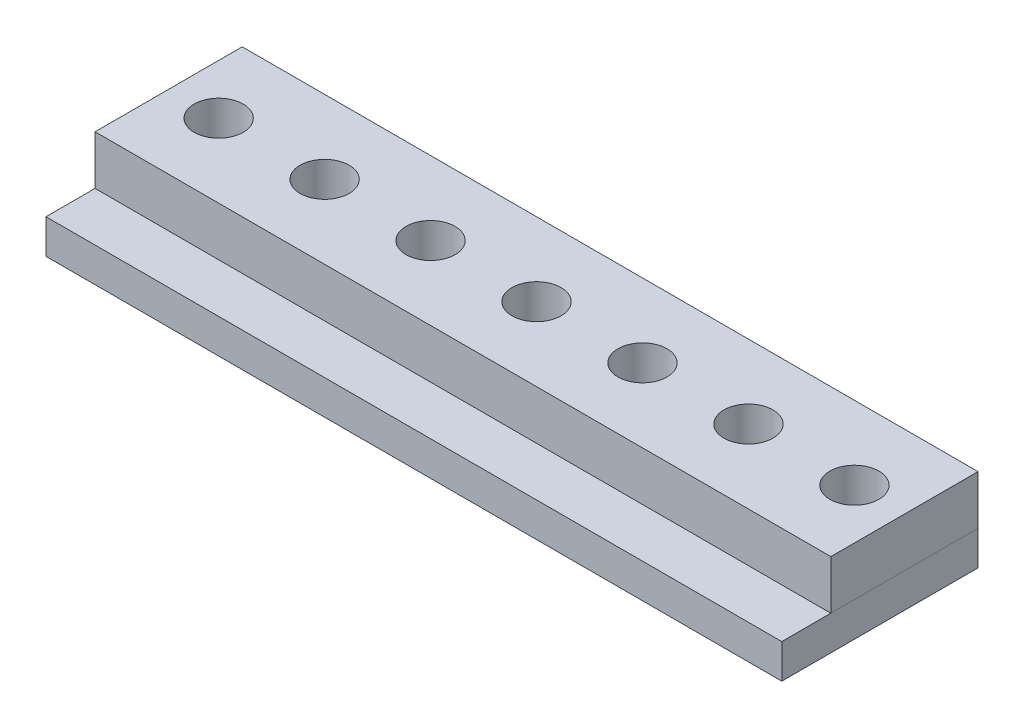
ISO-10303-21;
HEADER;
FILE_DESCRIPTION(('STEP AP214'),'2;1');
FILE_NAME('part.step','',(''),(''),'','','');
FILE_SCHEMA(('AUTOMOTIVE_DESIGN { 1 0 10303 214 1 1 1 1 }'));
ENDSEC;
DATA;
#1=APPLICATION_CONTEXT('core data for automotive mechanical design processes');
#2=APPLICATION_PROTOCOL_DEFINITION('international standard','automotive_design',2000,#1);
#3=PRODUCT_CONTEXT('',#1,'mechanical');
#4=PRODUCT('Part','Part','',(#3));
#5=PRODUCT_RELATED_PRODUCT_CATEGORY('part','',(#4));
#6=PRODUCT_DEFINITION_FORMATION('','',#4);
#7=PRODUCT_DEFINITION_CONTEXT('part definition',#1,'design');
#8=PRODUCT_DEFINITION('design','',#6,#7);
#9=PRODUCT_DEFINITION_SHAPE('','',#8);
#10=(LENGTH_UNIT() NAMED_UNIT(*) SI_UNIT(.MILLI.,.METRE.));
#11=(NAMED_UNIT(*) PLANE_ANGLE_UNIT() SI_UNIT($,.RADIAN.));
#12=(NAMED_UNIT(*) SI_UNIT($,.STERADIAN.) SOLID_ANGLE_UNIT());
#13=UNCERTAINTY_MEASURE_WITH_UNIT(LENGTH_MEASURE(1.E-05),#10,'distance_accuracy_value','');
#14=(GEOMETRIC_REPRESENTATION_CONTEXT(3) GLOBAL_UNCERTAINTY_ASSIGNED_CONTEXT((#13)) GLOBAL_UNIT_ASSIGNED_CONTEXT((#10,
#11,#12)) REPRESENTATION_CONTEXT('',''));
#15=CARTESIAN_POINT('',(0.,0.,0.));
#16=DIRECTION('',(0.,0.,1.));
#17=DIRECTION('',(1.,0.,0.));
#18=AXIS2_PLACEMENT_3D('',#15,#16,#17);
#19=CARTESIAN_POINT('',(-750.,-70.,-150.));
#20=DIRECTION('',(1.,0.,0.));
#21=DIRECTION('',(0.,0.,-1.));
#22=AXIS2_PLACEMENT_3D('',#19,#20,#21);
#23=PLANE('',#22);
#24=DIRECTION('',(0.,0.,-1.));
#25=VECTOR('',#24,1.);
#26=CARTESIAN_POINT('',(-750.,0.,-150.));
#27=LINE('',#26,#25);
#28=CARTESIAN_POINT('',(-750.,0.,250.));
#29=VERTEX_POINT('',#28);
#30=CARTESIAN_POINT('',(-750.,0.,-150.));
#31=VERTEX_POINT('',#30);
#32=EDGE_CURVE('E117',#29,#31,#27,.T.);
#33=ORIENTED_EDGE('',*,*,#32,.T.);
#34=DIRECTION('',(0.,1.,0.));
#35=VECTOR('',#34,1.);
#36=CARTESIAN_POINT('',(-750.,-70.,-150.));
#37=LINE('',#36,#35);
#38=CARTESIAN_POINT('',(-750.,-70.,-150.));
#39=VERTEX_POINT('',#38);
#40=EDGE_CURVE('E12',#39,#31,#37,.T.);
#41=ORIENTED_EDGE('',*,*,#40,.F.);
#42=DIRECTION('',(0.,0.,-1.));
#43=VECTOR('',#42,1.);
#44=CARTESIAN_POINT('',(-750.,-70.,-150.));
#45=LINE('',#44,#43);
#46=CARTESIAN_POINT('',(-750.,-70.,250.));
#47=VERTEX_POINT('',#46);
#48=EDGE_CURVE('E101',#47,#39,#45,.T.);
#49=ORIENTED_EDGE('',*,*,#48,.F.);
#50=DIRECTION('',(0.,1.,0.));
#51=VECTOR('',#50,1.);
#52=CARTESIAN_POINT('',(-750.,-70.,250.));
#53=LINE('',#52,#51);
#54=EDGE_CURVE('E113',#47,#29,#53,.T.);
#55=ORIENTED_EDGE('',*,*,#54,.T.);
#56=EDGE_LOOP('',(#33,#41,#49,#55));
#57=FACE_BOUND('',#56,.T.);
#58=ADVANCED_FACE('F49',(#57),#23,.F.);
#59=CARTESIAN_POINT('',(-750.,-70.,-150.));
#60=DIRECTION('',(0.,0.,1.));
#61=DIRECTION('',(1.,0.,0.));
#62=AXIS2_PLACEMENT_3D('',#59,#60,#61);
#63=PLANE('',#62);
#64=DIRECTION('',(1.,0.,0.));
#65=VECTOR('',#64,1.);
#66=CARTESIAN_POINT('',(-750.,0.,-150.));
#67=LINE('',#66,#65);
#68=CARTESIAN_POINT('',(750.,0.,-150.));
#69=VERTEX_POINT('',#68);
#70=EDGE_CURVE('E106',#31,#69,#67,.T.);
#71=ORIENTED_EDGE('',*,*,#70,.T.);
#72=DIRECTION('',(0.,1.,0.));
#73=VECTOR('',#72,1.);
#74=CARTESIAN_POINT('',(750.,-70.,-150.));
#75=LINE('',#74,#73);
#76=CARTESIAN_POINT('',(750.,-70.,-150.));
#77=VERTEX_POINT('',#76);
#78=EDGE_CURVE('E58',#77,#69,#75,.T.);
#79=ORIENTED_EDGE('',*,*,#78,.F.);
#80=DIRECTION('',(1.,0.,0.));
#81=VECTOR('',#80,1.);
#82=CARTESIAN_POINT('',(-750.,-70.,-150.));
#83=LINE('',#82,#81);
#84=EDGE_CURVE('E96',#39,#77,#83,.T.);
#85=ORIENTED_EDGE('',*,*,#84,.F.);
#86=ORIENTED_EDGE('',*,*,#40,.T.);
#87=EDGE_LOOP('',(#71,#79,#85,#86));
#88=FACE_BOUND('',#87,.T.);
#89=ADVANCED_FACE('F105',(#88),#63,.F.);
#90=CARTESIAN_POINT('',(750.,-70.,-150.));
#91=DIRECTION('',(-1.,0.,0.));
#92=DIRECTION('',(0.,0.,1.));
#93=AXIS2_PLACEMENT_3D('',#90,#91,#92);
#94=PLANE('',#93);
#95=DIRECTION('',(0.,0.,1.));
#96=VECTOR('',#95,1.);
#97=CARTESIAN_POINT('',(750.,0.,-150.));
#98=LINE('',#97,#96);
#99=CARTESIAN_POINT('',(750.,0.,250.));
#100=VERTEX_POINT('',#99);
#101=EDGE_CURVE('E83',#69,#100,#98,.T.);
#102=ORIENTED_EDGE('',*,*,#101,.T.);
#103=DIRECTION('',(0.,1.,0.));
#104=VECTOR('',#103,1.);
#105=CARTESIAN_POINT('',(750.,-70.,250.));
#106=LINE('',#105,#104);
#107=CARTESIAN_POINT('',(750.,-70.,250.));
#108=VERTEX_POINT('',#107);
#109=EDGE_CURVE('E108',#108,#100,#106,.T.);
#110=ORIENTED_EDGE('',*,*,#109,.F.);
#111=DIRECTION('',(0.,0.,1.));
#112=VECTOR('',#111,1.);
#113=CARTESIAN_POINT('',(750.,-70.,-150.));
#114=LINE('',#113,#112);
#115=EDGE_CURVE('E99',#77,#108,#114,.T.);
#116=ORIENTED_EDGE('',*,*,#115,.F.);
#117=ORIENTED_EDGE('',*,*,#78,.T.);
#118=EDGE_LOOP('',(#102,#110,#116,#117));
#119=FACE_BOUND('',#118,.T.);
#120=ADVANCED_FACE('F109',(#119),#94,.F.);
#121=CARTESIAN_POINT('',(-750.,-70.,250.));
#122=DIRECTION('',(0.,0.,-1.));
#123=DIRECTION('',(-1.,0.,0.));
#124=AXIS2_PLACEMENT_3D('',#121,#122,#123);
#125=PLANE('',#124);
#126=DIRECTION('',(-1.,0.,0.));
#127=VECTOR('',#126,1.);
#128=CARTESIAN_POINT('',(-750.,0.,250.));
#129=LINE('',#128,#127);
#130=EDGE_CURVE('E89',#100,#29,#129,.T.);
#131=ORIENTED_EDGE('',*,*,#130,.T.);
#132=ORIENTED_EDGE('',*,*,#54,.F.);
#133=DIRECTION('',(-1.,0.,0.));
#134=VECTOR('',#133,1.);
#135=CARTESIAN_POINT('',(-750.,-70.,250.));
#136=LINE('',#135,#134);
#137=EDGE_CURVE('E66',#108,#47,#136,.T.);
#138=ORIENTED_EDGE('',*,*,#137,.F.);
#139=ORIENTED_EDGE('',*,*,#109,.T.);
#140=EDGE_LOOP('',(#131,#132,#138,#139));
#141=FACE_BOUND('',#140,.T.);
#142=ADVANCED_FACE('F130',(#141),#125,.F.);
#143=CARTESIAN_POINT('',(0.,-70.,0.));
#144=DIRECTION('',(0.,1.,0.));
#145=DIRECTION('',(0.,0.,1.));
#146=AXIS2_PLACEMENT_3D('',#143,#144,#145);
#147=PLANE('',#146);
#148=ORIENTED_EDGE('',*,*,#48,.T.);
#149=ORIENTED_EDGE('',*,*,#84,.T.);
#150=ORIENTED_EDGE('',*,*,#115,.T.);
#151=ORIENTED_EDGE('',*,*,#137,.T.);
#152=EDGE_LOOP('',(#148,#149,#150,#151));
#153=FACE_BOUND('',#152,.T.);
#154=ADVANCED_FACE('F97',(#153),#147,.F.);
#155=CARTESIAN_POINT('',(0.,0.,0.));
#156=DIRECTION('',(0.,1.,0.));
#157=DIRECTION('',(0.,0.,1.));
#158=AXIS2_PLACEMENT_3D('',#155,#156,#157);
#159=PLANE('',#158);
#160=ORIENTED_EDGE('',*,*,#32,.F.);
#161=ORIENTED_EDGE('',*,*,#130,.F.);
#162=ORIENTED_EDGE('',*,*,#101,.F.);
#163=ORIENTED_EDGE('',*,*,#70,.F.);
#164=EDGE_LOOP('',(#160,#161,#162,#163));
#165=FACE_BOUND('',#164,.T.);
#166=ADVANCED_FACE('F133',(#165),#159,.T.);
#167=CLOSED_SHELL('',(#58,#89,#120,#142,#154,#166));
#168=MANIFOLD_SOLID_BREP('B2',#167);
#169=CARTESIAN_POINT('',(0.,100.,0.));
#170=DIRECTION('',(0.,-1.,0.));
#171=DIRECTION('',(0.,0.,-1.));
#172=AXIS2_PLACEMENT_3D('',#169,#170,#171);
#173=PLANE('',#172);
#174=DIRECTION('',(0.,0.,-1.));
#175=VECTOR('',#174,1.);
#176=CARTESIAN_POINT('',(750.,100.,150.));
#177=LINE('',#176,#175);
#178=CARTESIAN_POINT('',(750.,100.,150.));
#179=VERTEX_POINT('',#178);
#180=CARTESIAN_POINT('',(750.,100.,-150.));
#181=VERTEX_POINT('',#180);
#182=EDGE_CURVE('E237',#179,#181,#177,.T.);
#183=ORIENTED_EDGE('',*,*,#182,.T.);
#184=DIRECTION('',(-1.,0.,0.));
#185=VECTOR('',#184,1.);
#186=CARTESIAN_POINT('',(-750.,100.,-150.));
#187=LINE('',#186,#185);
#188=CARTESIAN_POINT('',(-750.,100.,-150.));
#189=VERTEX_POINT('',#188);
#190=EDGE_CURVE('E232',#181,#189,#187,.T.);
#191=ORIENTED_EDGE('',*,*,#190,.T.);
#192=DIRECTION('',(0.,0.,1.));
#193=VECTOR('',#192,1.);
#194=CARTESIAN_POINT('',(-750.,100.,150.));
#195=LINE('',#194,#193);
#196=CARTESIAN_POINT('',(-750.,100.,150.));
#197=VERTEX_POINT('',#196);
#198=EDGE_CURVE('E235',#189,#197,#195,.T.);
#199=ORIENTED_EDGE('',*,*,#198,.T.);
#200=DIRECTION('',(1.,0.,0.));
#201=VECTOR('',#200,1.);
#202=CARTESIAN_POINT('',(-750.,100.,150.));
#203=LINE('',#202,#201);
#204=EDGE_CURVE('E202',#197,#179,#203,.T.);
#205=ORIENTED_EDGE('',*,*,#204,.T.);
#206=EDGE_LOOP('',(#183,#191,#199,#205));
#207=FACE_BOUND('',#206,.T.);
#208=CARTESIAN_POINT('',(-648.,100.,0.));
#209=DIRECTION('',(0.,1.,0.));
#210=DIRECTION('',(0.,0.,1.));
#211=AXIS2_PLACEMENT_3D('',#208,#209,#210);
#212=CIRCLE('',#211,50.);
#213=CARTESIAN_POINT('',(-648.,100.,50.));
#214=VERTEX_POINT('',#213);
#215=EDGE_CURVE('E252',#214,#214,#212,.T.);
#216=ORIENTED_EDGE('',*,*,#215,.F.);
#217=EDGE_LOOP('',(#216));
#218=FACE_BOUND('',#217,.T.);
#219=CARTESIAN_POINT('',(-432.,100.,0.));
#220=DIRECTION('',(0.,1.,0.));
#221=DIRECTION('',(0.,0.,1.));
#222=AXIS2_PLACEMENT_3D('',#219,#220,#221);
#223=CIRCLE('',#222,50.);
#224=CARTESIAN_POINT('',(-432.,100.,50.));
#225=VERTEX_POINT('',#224);
#226=EDGE_CURVE('E267',#225,#225,#223,.T.);
#227=ORIENTED_EDGE('',*,*,#226,.F.);
#228=EDGE_LOOP('',(#227));
#229=FACE_BOUND('',#228,.T.);
#230=CARTESIAN_POINT('',(-216.,100.,0.));
#231=DIRECTION('',(0.,1.,0.));
#232=DIRECTION('',(0.,0.,1.));
#233=AXIS2_PLACEMENT_3D('',#230,#231,#232);
#234=CIRCLE('',#233,50.);
#235=CARTESIAN_POINT('',(-216.,100.,50.));
#236=VERTEX_POINT('',#235);
#237=EDGE_CURVE('E273',#236,#236,#234,.T.);
#238=ORIENTED_EDGE('',*,*,#237,.F.);
#239=EDGE_LOOP('',(#238));
#240=FACE_BOUND('',#239,.T.);
#241=CARTESIAN_POINT('',(2.22044604925031E-13,100.,0.));
#242=DIRECTION('',(0.,1.,0.));
#243=DIRECTION('',(0.,0.,1.));
#244=AXIS2_PLACEMENT_3D('',#241,#242,#243);
#245=CIRCLE('',#244,50.);
#246=CARTESIAN_POINT('',(2.22044604925031E-13,100.,50.));
#247=VERTEX_POINT('',#246);
#248=EDGE_CURVE('E279',#247,#247,#245,.T.);
#249=ORIENTED_EDGE('',*,*,#248,.F.);
#250=EDGE_LOOP('',(#249));
#251=FACE_BOUND('',#250,.T.);
#252=CARTESIAN_POINT('',(216.,100.,0.));
#253=DIRECTION('',(0.,1.,0.));
#254=DIRECTION('',(0.,0.,1.));
#255=AXIS2_PLACEMENT_3D('',#252,#253,#254);
#256=CIRCLE('',#255,50.);
#257=CARTESIAN_POINT('',(216.,100.,50.));
#258=VERTEX_POINT('',#257);
#259=EDGE_CURVE('E285',#258,#258,#256,.T.);
#260=ORIENTED_EDGE('',*,*,#259,.F.);
#261=EDGE_LOOP('',(#260));
#262=FACE_BOUND('',#261,.T.);
#263=CARTESIAN_POINT('',(432.,100.,0.));
#264=DIRECTION('',(0.,1.,0.));
#265=DIRECTION('',(0.,0.,1.));
#266=AXIS2_PLACEMENT_3D('',#263,#264,#265);
#267=CIRCLE('',#266,50.);
#268=CARTESIAN_POINT('',(432.,100.,50.));
#269=VERTEX_POINT('',#268);
#270=EDGE_CURVE('E291',#269,#269,#267,.T.);
#271=ORIENTED_EDGE('',*,*,#270,.F.);
#272=EDGE_LOOP('',(#271));
#273=FACE_BOUND('',#272,.T.);
#274=CARTESIAN_POINT('',(648.,100.,0.));
#275=DIRECTION('',(0.,1.,0.));
#276=DIRECTION('',(0.,0.,1.));
#277=AXIS2_PLACEMENT_3D('',#274,#275,#276);
#278=CIRCLE('',#277,50.);
#279=CARTESIAN_POINT('',(648.,100.,50.));
#280=VERTEX_POINT('',#279);
#281=EDGE_CURVE('E297',#280,#280,#278,.T.);
#282=ORIENTED_EDGE('',*,*,#281,.F.);
#283=EDGE_LOOP('',(#282));
#284=FACE_BOUND('',#283,.T.);
#285=ADVANCED_FACE('F185',(#207,#218,#229,#240,#251,#262,#273,#284),#173,.F.);
#286=CARTESIAN_POINT('',(0.,0.,0.));
#287=DIRECTION('',(0.,-1.,0.));
#288=DIRECTION('',(0.,0.,-1.));
#289=AXIS2_PLACEMENT_3D('',#286,#287,#288);
#290=PLANE('',#289);
#291=CARTESIAN_POINT('',(432.,0.,0.));
#292=DIRECTION('',(0.,1.,0.));
#293=DIRECTION('',(0.,0.,1.));
#294=AXIS2_PLACEMENT_3D('',#291,#292,#293);
#295=CIRCLE('',#294,50.);
#296=CARTESIAN_POINT('',(432.,0.,50.));
#297=VERTEX_POINT('',#296);
#298=EDGE_CURVE('E294',#297,#297,#295,.T.);
#299=ORIENTED_EDGE('',*,*,#298,.T.);
#300=EDGE_LOOP('',(#299));
#301=FACE_BOUND('',#300,.T.);
#302=CARTESIAN_POINT('',(2.22044604925031E-13,0.,0.));
#303=DIRECTION('',(0.,1.,0.));
#304=DIRECTION('',(0.,0.,1.));
#305=AXIS2_PLACEMENT_3D('',#302,#303,#304);
#306=CIRCLE('',#305,50.);
#307=CARTESIAN_POINT('',(2.22044604925031E-13,0.,50.));
#308=VERTEX_POINT('',#307);
#309=EDGE_CURVE('E282',#308,#308,#306,.T.);
#310=ORIENTED_EDGE('',*,*,#309,.T.);
#311=EDGE_LOOP('',(#310));
#312=FACE_BOUND('',#311,.T.);
#313=CARTESIAN_POINT('',(-432.,0.,0.));
#314=DIRECTION('',(0.,1.,0.));
#315=DIRECTION('',(0.,0.,1.));
#316=AXIS2_PLACEMENT_3D('',#313,#314,#315);
#317=CIRCLE('',#316,50.);
#318=CARTESIAN_POINT('',(-432.,0.,50.));
#319=VERTEX_POINT('',#318);
#320=EDGE_CURVE('E270',#319,#319,#317,.T.);
#321=ORIENTED_EDGE('',*,*,#320,.T.);
#322=EDGE_LOOP('',(#321));
#323=FACE_BOUND('',#322,.T.);
#324=DIRECTION('',(0.,0.,-1.));
#325=VECTOR('',#324,1.);
#326=CARTESIAN_POINT('',(750.,0.,150.));
#327=LINE('',#326,#325);
#328=CARTESIAN_POINT('',(750.,0.,150.));
#329=VERTEX_POINT('',#328);
#330=CARTESIAN_POINT('',(750.,0.,-150.));
#331=VERTEX_POINT('',#330);
#332=EDGE_CURVE('E249',#329,#331,#327,.T.);
#333=ORIENTED_EDGE('',*,*,#332,.F.);
#334=DIRECTION('',(1.,0.,0.));
#335=VECTOR('',#334,1.);
#336=CARTESIAN_POINT('',(-750.,0.,150.));
#337=LINE('',#336,#335);
#338=CARTESIAN_POINT('',(-750.,0.,150.));
#339=VERTEX_POINT('',#338);
#340=EDGE_CURVE('E225',#339,#329,#337,.T.);
#341=ORIENTED_EDGE('',*,*,#340,.F.);
#342=DIRECTION('',(0.,0.,1.));
#343=VECTOR('',#342,1.);
#344=CARTESIAN_POINT('',(-750.,0.,150.));
#345=LINE('',#344,#343);
#346=CARTESIAN_POINT('',(-750.,0.,-150.));
#347=VERTEX_POINT('',#346);
#348=EDGE_CURVE('E219',#347,#339,#345,.T.);
#349=ORIENTED_EDGE('',*,*,#348,.F.);
#350=DIRECTION('',(-1.,0.,0.));
#351=VECTOR('',#350,1.);
#352=CARTESIAN_POINT('',(-750.,0.,-150.));
#353=LINE('',#352,#351);
#354=EDGE_CURVE('E241',#331,#347,#353,.T.);
#355=ORIENTED_EDGE('',*,*,#354,.F.);
#356=EDGE_LOOP('',(#333,#341,#349,#355));
#357=FACE_BOUND('',#356,.T.);
#358=CARTESIAN_POINT('',(-648.,0.,0.));
#359=DIRECTION('',(0.,1.,0.));
#360=DIRECTION('',(0.,0.,1.));
#361=AXIS2_PLACEMENT_3D('',#358,#359,#360);
#362=CIRCLE('',#361,50.);
#363=CARTESIAN_POINT('',(-648.,0.,50.));
#364=VERTEX_POINT('',#363);
#365=EDGE_CURVE('E264',#364,#364,#362,.T.);
#366=ORIENTED_EDGE('',*,*,#365,.T.);
#367=EDGE_LOOP('',(#366));
#368=FACE_BOUND('',#367,.T.);
#369=CARTESIAN_POINT('',(-216.,0.,0.));
#370=DIRECTION('',(0.,1.,0.));
#371=DIRECTION('',(0.,0.,1.));
#372=AXIS2_PLACEMENT_3D('',#369,#370,#371);
#373=CIRCLE('',#372,50.);
#374=CARTESIAN_POINT('',(-216.,0.,50.));
#375=VERTEX_POINT('',#374);
#376=EDGE_CURVE('E276',#375,#375,#373,.T.);
#377=ORIENTED_EDGE('',*,*,#376,.T.);
#378=EDGE_LOOP('',(#377));
#379=FACE_BOUND('',#378,.T.);
#380=CARTESIAN_POINT('',(216.,0.,0.));
#381=DIRECTION('',(0.,1.,0.));
#382=DIRECTION('',(0.,0.,1.));
#383=AXIS2_PLACEMENT_3D('',#380,#381,#382);
#384=CIRCLE('',#383,50.);
#385=CARTESIAN_POINT('',(216.,0.,50.));
#386=VERTEX_POINT('',#385);
#387=EDGE_CURVE('E288',#386,#386,#384,.T.);
#388=ORIENTED_EDGE('',*,*,#387,.T.);
#389=EDGE_LOOP('',(#388));
#390=FACE_BOUND('',#389,.T.);
#391=CARTESIAN_POINT('',(648.,0.,0.));
#392=DIRECTION('',(0.,1.,0.));
#393=DIRECTION('',(0.,0.,1.));
#394=AXIS2_PLACEMENT_3D('',#391,#392,#393);
#395=CIRCLE('',#394,50.);
#396=CARTESIAN_POINT('',(648.,0.,50.));
#397=VERTEX_POINT('',#396);
#398=EDGE_CURVE('E300',#397,#397,#395,.T.);
#399=ORIENTED_EDGE('',*,*,#398,.T.);
#400=EDGE_LOOP('',(#399));
#401=FACE_BOUND('',#400,.T.);
#402=ADVANCED_FACE('F260',(#301,#312,#323,#357,#368,#379,#390,#401),#290,.T.);
#403=CARTESIAN_POINT('',(750.,100.,150.));
#404=DIRECTION('',(-1.,0.,0.));
#405=DIRECTION('',(0.,0.,1.));
#406=AXIS2_PLACEMENT_3D('',#403,#404,#405);
#407=PLANE('',#406);
#408=ORIENTED_EDGE('',*,*,#332,.T.);
#409=DIRECTION('',(0.,-1.,0.));
#410=VECTOR('',#409,1.);
#411=CARTESIAN_POINT('',(750.,100.,-150.));
#412=LINE('',#411,#410);
#413=EDGE_CURVE('E47',#181,#331,#412,.T.);
#414=ORIENTED_EDGE('',*,*,#413,.F.);
#415=ORIENTED_EDGE('',*,*,#182,.F.);
#416=DIRECTION('',(0.,-1.,0.));
#417=VECTOR('',#416,1.);
#418=CARTESIAN_POINT('',(750.,100.,150.));
#419=LINE('',#418,#417);
#420=EDGE_CURVE('E245',#179,#329,#419,.T.);
#421=ORIENTED_EDGE('',*,*,#420,.T.);
#422=EDGE_LOOP('',(#408,#414,#415,#421));
#423=FACE_BOUND('',#422,.T.);
#424=ADVANCED_FACE('F187',(#423),#407,.F.);
#425=CARTESIAN_POINT('',(-750.,100.,-150.));
#426=DIRECTION('',(0.,0.,1.));
#427=DIRECTION('',(1.,0.,0.));
#428=AXIS2_PLACEMENT_3D('',#425,#426,#427);
#429=PLANE('',#428);
#430=ORIENTED_EDGE('',*,*,#354,.T.);
#431=DIRECTION('',(0.,-1.,0.));
#432=VECTOR('',#431,1.);
#433=CARTESIAN_POINT('',(-750.,100.,-150.));
#434=LINE('',#433,#432);
#435=EDGE_CURVE('E194',#189,#347,#434,.T.);
#436=ORIENTED_EDGE('',*,*,#435,.F.);
#437=ORIENTED_EDGE('',*,*,#190,.F.);
#438=ORIENTED_EDGE('',*,*,#413,.T.);
#439=EDGE_LOOP('',(#430,#436,#437,#438));
#440=FACE_BOUND('',#439,.T.);
#441=ADVANCED_FACE('F240',(#440),#429,.F.);
#442=CARTESIAN_POINT('',(-750.,100.,150.));
#443=DIRECTION('',(1.,0.,0.));
#444=DIRECTION('',(0.,0.,-1.));
#445=AXIS2_PLACEMENT_3D('',#442,#443,#444);
#446=PLANE('',#445);
#447=ORIENTED_EDGE('',*,*,#348,.T.);
#448=DIRECTION('',(0.,-1.,0.));
#449=VECTOR('',#448,1.);
#450=CARTESIAN_POINT('',(-750.,100.,150.));
#451=LINE('',#450,#449);
#452=EDGE_CURVE('E242',#197,#339,#451,.T.);
#453=ORIENTED_EDGE('',*,*,#452,.F.);
#454=ORIENTED_EDGE('',*,*,#198,.F.);
#455=ORIENTED_EDGE('',*,*,#435,.T.);
#456=EDGE_LOOP('',(#447,#453,#454,#455));
#457=FACE_BOUND('',#456,.T.);
#458=ADVANCED_FACE('F243',(#457),#446,.F.);
#459=CARTESIAN_POINT('',(-750.,100.,150.));
#460=DIRECTION('',(0.,0.,-1.));
#461=DIRECTION('',(-1.,0.,0.));
#462=AXIS2_PLACEMENT_3D('',#459,#460,#461);
#463=PLANE('',#462);
#464=ORIENTED_EDGE('',*,*,#340,.T.);
#465=ORIENTED_EDGE('',*,*,#420,.F.);
#466=ORIENTED_EDGE('',*,*,#204,.F.);
#467=ORIENTED_EDGE('',*,*,#452,.T.);
#468=EDGE_LOOP('',(#464,#465,#466,#467));
#469=FACE_BOUND('',#468,.T.);
#470=ADVANCED_FACE('F257',(#469),#463,.F.);
#471=CARTESIAN_POINT('',(-648.,100.,0.));
#472=DIRECTION('',(0.,-1.,0.));
#473=DIRECTION('',(0.,0.,-1.));
#474=AXIS2_PLACEMENT_3D('',#471,#472,#473);
#475=CYLINDRICAL_SURFACE('',#474,50.);
#476=ORIENTED_EDGE('',*,*,#215,.T.);
#477=EDGE_LOOP('',(#476));
#478=FACE_BOUND('',#477,.T.);
#479=ORIENTED_EDGE('',*,*,#365,.F.);
#480=EDGE_LOOP('',(#479));
#481=FACE_BOUND('',#480,.T.);
#482=ADVANCED_FACE('F317',(#478,#481),#475,.F.);
#483=CARTESIAN_POINT('',(-432.,100.,0.));
#484=DIRECTION('',(0.,-1.,0.));
#485=DIRECTION('',(0.,0.,-1.));
#486=AXIS2_PLACEMENT_3D('',#483,#484,#485);
#487=CYLINDRICAL_SURFACE('',#486,50.);
#488=ORIENTED_EDGE('',*,*,#226,.T.);
#489=EDGE_LOOP('',(#488));
#490=FACE_BOUND('',#489,.T.);
#491=ORIENTED_EDGE('',*,*,#320,.F.);
#492=EDGE_LOOP('',(#491));
#493=FACE_BOUND('',#492,.T.);
#494=ADVANCED_FACE('F363',(#490,#493),#487,.F.);
#495=CARTESIAN_POINT('',(-216.,100.,0.));
#496=DIRECTION('',(0.,-1.,0.));
#497=DIRECTION('',(0.,0.,-1.));
#498=AXIS2_PLACEMENT_3D('',#495,#496,#497);
#499=CYLINDRICAL_SURFACE('',#498,50.);
#500=ORIENTED_EDGE('',*,*,#237,.T.);
#501=EDGE_LOOP('',(#500));
#502=FACE_BOUND('',#501,.T.);
#503=ORIENTED_EDGE('',*,*,#376,.F.);
#504=EDGE_LOOP('',(#503));
#505=FACE_BOUND('',#504,.T.);
#506=ADVANCED_FACE('F371',(#502,#505),#499,.F.);
#507=CARTESIAN_POINT('',(2.22044604925031E-13,100.,0.));
#508=DIRECTION('',(0.,-1.,0.));
#509=DIRECTION('',(0.,0.,-1.));
#510=AXIS2_PLACEMENT_3D('',#507,#508,#509);
#511=CYLINDRICAL_SURFACE('',#510,50.);
#512=ORIENTED_EDGE('',*,*,#248,.T.);
#513=EDGE_LOOP('',(#512));
#514=FACE_BOUND('',#513,.T.);
#515=ORIENTED_EDGE('',*,*,#309,.F.);
#516=EDGE_LOOP('',(#515));
#517=FACE_BOUND('',#516,.T.);
#518=ADVANCED_FACE('F379',(#514,#517),#511,.F.);
#519=CARTESIAN_POINT('',(216.,100.,0.));
#520=DIRECTION('',(0.,-1.,0.));
#521=DIRECTION('',(0.,0.,-1.));
#522=AXIS2_PLACEMENT_3D('',#519,#520,#521);
#523=CYLINDRICAL_SURFACE('',#522,50.);
#524=ORIENTED_EDGE('',*,*,#259,.T.);
#525=EDGE_LOOP('',(#524));
#526=FACE_BOUND('',#525,.T.);
#527=ORIENTED_EDGE('',*,*,#387,.F.);
#528=EDGE_LOOP('',(#527));
#529=FACE_BOUND('',#528,.T.);
#530=ADVANCED_FACE('F388',(#526,#529),#523,.F.);
#531=CARTESIAN_POINT('',(432.,100.,0.));
#532=DIRECTION('',(0.,-1.,0.));
#533=DIRECTION('',(0.,0.,-1.));
#534=AXIS2_PLACEMENT_3D('',#531,#532,#533);
#535=CYLINDRICAL_SURFACE('',#534,50.);
#536=ORIENTED_EDGE('',*,*,#270,.T.);
#537=EDGE_LOOP('',(#536));
#538=FACE_BOUND('',#537,.T.);
#539=ORIENTED_EDGE('',*,*,#298,.F.);
#540=EDGE_LOOP('',(#539));
#541=FACE_BOUND('',#540,.T.);
#542=ADVANCED_FACE('F397',(#538,#541),#535,.F.);
#543=CARTESIAN_POINT('',(648.,100.,0.));
#544=DIRECTION('',(0.,-1.,0.));
#545=DIRECTION('',(0.,0.,-1.));
#546=AXIS2_PLACEMENT_3D('',#543,#544,#545);
#547=CYLINDRICAL_SURFACE('',#546,50.);
#548=ORIENTED_EDGE('',*,*,#281,.T.);
#549=EDGE_LOOP('',(#548));
#550=FACE_BOUND('',#549,.T.);
#551=ORIENTED_EDGE('',*,*,#398,.F.);
#552=EDGE_LOOP('',(#551));
#553=FACE_BOUND('',#552,.T.);
#554=ADVANCED_FACE('F306',(#550,#553),#547,.F.);
#555=CLOSED_SHELL('',(#285,#402,#424,#441,#458,#470,#482,#494,#506,#518,#530,#542,#554));
#556=MANIFOLD_SOLID_BREP('B6',#555);
#557=ADVANCED_BREP_SHAPE_REPRESENTATION('',(#18,#168,#556),#14);
#558=SHAPE_DEFINITION_REPRESENTATION(#9,#557);
ENDSEC;
END-ISO-10303-21;
